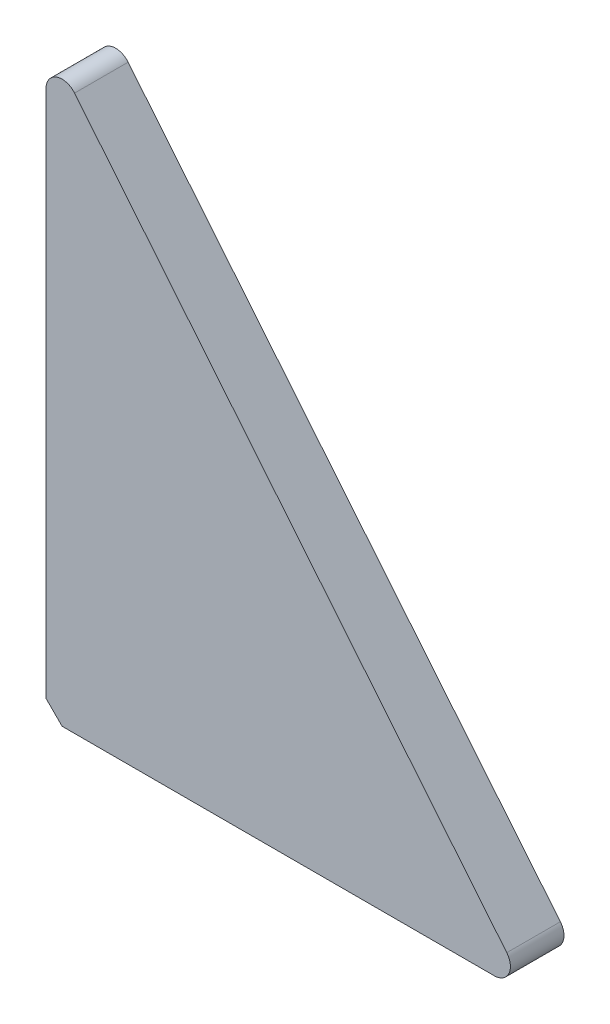
ISO-10303-21;
HEADER;
FILE_DESCRIPTION(('STEP AP214'),'2;1');
FILE_NAME('part.step','',(''),(''),'','','');
FILE_SCHEMA(('AUTOMOTIVE_DESIGN { 1 0 10303 214 1 1 1 1 }'));
ENDSEC;
DATA;
#1=APPLICATION_CONTEXT('core data for automotive mechanical design processes');
#2=APPLICATION_PROTOCOL_DEFINITION('international standard','automotive_design',2000,#1);
#3=PRODUCT_CONTEXT('',#1,'mechanical');
#4=PRODUCT('Part','Part','',(#3));
#5=PRODUCT_RELATED_PRODUCT_CATEGORY('part','',(#4));
#6=PRODUCT_DEFINITION_FORMATION('','',#4);
#7=PRODUCT_DEFINITION_CONTEXT('part definition',#1,'design');
#8=PRODUCT_DEFINITION('design','',#6,#7);
#9=PRODUCT_DEFINITION_SHAPE('','',#8);
#10=(LENGTH_UNIT() NAMED_UNIT(*) SI_UNIT(.MILLI.,.METRE.));
#11=(NAMED_UNIT(*) PLANE_ANGLE_UNIT() SI_UNIT($,.RADIAN.));
#12=(NAMED_UNIT(*) SI_UNIT($,.STERADIAN.) SOLID_ANGLE_UNIT());
#13=UNCERTAINTY_MEASURE_WITH_UNIT(LENGTH_MEASURE(1.E-05),#10,'distance_accuracy_value','');
#14=(GEOMETRIC_REPRESENTATION_CONTEXT(3) GLOBAL_UNCERTAINTY_ASSIGNED_CONTEXT((#13)) GLOBAL_UNIT_ASSIGNED_CONTEXT((#10,
#11,#12)) REPRESENTATION_CONTEXT('',''));
#15=CARTESIAN_POINT('',(0.,0.,0.));
#16=DIRECTION('',(0.,0.,1.));
#17=DIRECTION('',(1.,0.,0.));
#18=AXIS2_PLACEMENT_3D('',#15,#16,#17);
#19=CARTESIAN_POINT('',(90.,0.,10.));
#20=DIRECTION('',(0.,1.,0.));
#21=DIRECTION('',(-1.,0.,0.));
#22=AXIS2_PLACEMENT_3D('',#19,#20,#21);
#23=PLANE('',#22);
#24=DIRECTION('',(1.,0.,0.));
#25=VECTOR('',#24,1.);
#26=CARTESIAN_POINT('',(90.,0.,0.));
#27=LINE('',#26,#25);
#28=CARTESIAN_POINT('',(3.00000000000006,0.,0.));
#29=VERTEX_POINT('',#28);
#30=CARTESIAN_POINT('',(83.6692717081222,0.,0.));
#31=VERTEX_POINT('',#30);
#32=EDGE_CURVE('E105',#29,#31,#27,.T.);
#33=ORIENTED_EDGE('',*,*,#32,.T.);
#34=DIRECTION('',(0.,0.,-1.));
#35=VECTOR('',#34,1.);
#36=CARTESIAN_POINT('',(83.6692717081222,0.,10.));
#37=LINE('',#36,#35);
#38=CARTESIAN_POINT('',(83.6692717081222,0.,10.));
#39=VERTEX_POINT('',#38);
#40=EDGE_CURVE('E60',#31,#39,#37,.F.);
#41=ORIENTED_EDGE('',*,*,#40,.T.);
#42=DIRECTION('',(1.,0.,0.));
#43=VECTOR('',#42,1.);
#44=CARTESIAN_POINT('',(90.,0.,10.));
#45=LINE('',#44,#43);
#46=CARTESIAN_POINT('',(3.00000000000006,0.,10.));
#47=VERTEX_POINT('',#46);
#48=EDGE_CURVE('E106',#47,#39,#45,.T.);
#49=ORIENTED_EDGE('',*,*,#48,.F.);
#50=DIRECTION('',(0.,0.,-1.));
#51=VECTOR('',#50,1.);
#52=CARTESIAN_POINT('',(3.00000000000003,0.,10.));
#53=LINE('',#52,#51);
#54=EDGE_CURVE('E98',#47,#29,#53,.T.);
#55=ORIENTED_EDGE('',*,*,#54,.T.);
#56=EDGE_LOOP('',(#33,#41,#49,#55));
#57=FACE_BOUND('',#56,.T.);
#58=ADVANCED_FACE('F37',(#57),#23,.F.);
#59=CARTESIAN_POINT('',(0.,110.,10.));
#60=DIRECTION('',(-0.773957299203321,-0.633237790257263,0.));
#61=DIRECTION('',(0.633237790257263,-0.773957299203321,0.));
#62=AXIS2_PLACEMENT_3D('',#59,#60,#61);
#63=PLANE('',#62);
#64=DIRECTION('',(-0.633237790257263,0.773957299203321,0.));
#65=VECTOR('',#64,1.);
#66=CARTESIAN_POINT('',(0.,110.,10.));
#67=LINE('',#66,#65);
#68=CARTESIAN_POINT('',(85.9911436057322,4.89971337077176,10.));
#69=VERTEX_POINT('',#68);
#70=CARTESIAN_POINT('',(5.32187189760997,103.495489902921,10.));
#71=VERTEX_POINT('',#70);
#72=EDGE_CURVE('E136',#69,#71,#67,.T.);
#73=ORIENTED_EDGE('',*,*,#72,.F.);
#74=DIRECTION('',(0.,0.,-1.));
#75=VECTOR('',#74,1.);
#76=CARTESIAN_POINT('',(85.9911436057322,4.89971337077176,10.));
#77=LINE('',#76,#75);
#78=CARTESIAN_POINT('',(85.9911436057322,4.89971337077176,0.));
#79=VERTEX_POINT('',#78);
#80=EDGE_CURVE('E126',#69,#79,#77,.T.);
#81=ORIENTED_EDGE('',*,*,#80,.T.);
#82=DIRECTION('',(-0.633237790257263,0.773957299203321,0.));
#83=VECTOR('',#82,1.);
#84=CARTESIAN_POINT('',(0.,110.,0.));
#85=LINE('',#84,#83);
#86=CARTESIAN_POINT('',(5.32187189760997,103.495489902921,0.));
#87=VERTEX_POINT('',#86);
#88=EDGE_CURVE('E112',#79,#87,#85,.T.);
#89=ORIENTED_EDGE('',*,*,#88,.T.);
#90=DIRECTION('',(0.,0.,-1.));
#91=VECTOR('',#90,1.);
#92=CARTESIAN_POINT('',(5.32187189760997,103.495489902921,10.));
#93=LINE('',#92,#91);
#94=EDGE_CURVE('E124',#87,#71,#93,.F.);
#95=ORIENTED_EDGE('',*,*,#94,.T.);
#96=EDGE_LOOP('',(#73,#81,#89,#95));
#97=FACE_BOUND('',#96,.T.);
#98=ADVANCED_FACE('F140',(#97),#63,.F.);
#99=CARTESIAN_POINT('',(0.,0.,10.));
#100=DIRECTION('',(1.,0.,0.));
#101=DIRECTION('',(0.,0.,-1.));
#102=AXIS2_PLACEMENT_3D('',#99,#100,#101);
#103=PLANE('',#102);
#104=DIRECTION('',(0.,-1.,0.));
#105=VECTOR('',#104,1.);
#106=CARTESIAN_POINT('',(0.,0.,10.));
#107=LINE('',#106,#105);
#108=CARTESIAN_POINT('',(0.,101.595776532149,10.));
#109=VERTEX_POINT('',#108);
#110=CARTESIAN_POINT('',(0.,3.00000000000003,10.));
#111=VERTEX_POINT('',#110);
#112=EDGE_CURVE('E107',#109,#111,#107,.T.);
#113=ORIENTED_EDGE('',*,*,#112,.F.);
#114=DIRECTION('',(0.,0.,-1.));
#115=VECTOR('',#114,1.);
#116=CARTESIAN_POINT('',(0.,101.595776532149,10.));
#117=LINE('',#116,#115);
#118=CARTESIAN_POINT('',(0.,101.595776532149,0.));
#119=VERTEX_POINT('',#118);
#120=EDGE_CURVE('E11',#109,#119,#117,.T.);
#121=ORIENTED_EDGE('',*,*,#120,.T.);
#122=DIRECTION('',(0.,-1.,0.));
#123=VECTOR('',#122,1.);
#124=CARTESIAN_POINT('',(0.,0.,0.));
#125=LINE('',#124,#123);
#126=CARTESIAN_POINT('',(0.,3.00000000000003,0.));
#127=VERTEX_POINT('',#126);
#128=EDGE_CURVE('E115',#119,#127,#125,.T.);
#129=ORIENTED_EDGE('',*,*,#128,.T.);
#130=DIRECTION('',(0.,0.,1.));
#131=VECTOR('',#130,1.);
#132=CARTESIAN_POINT('',(0.,3.00000000000003,10.));
#133=LINE('',#132,#131);
#134=EDGE_CURVE('E100',#127,#111,#133,.T.);
#135=ORIENTED_EDGE('',*,*,#134,.T.);
#136=EDGE_LOOP('',(#113,#121,#129,#135));
#137=FACE_BOUND('',#136,.T.);
#138=ADVANCED_FACE('F155',(#137),#103,.F.);
#139=CARTESIAN_POINT('',(0.,0.,10.));
#140=DIRECTION('',(0.,0.,-1.));
#141=DIRECTION('',(-1.,0.,0.));
#142=AXIS2_PLACEMENT_3D('',#139,#140,#141);
#143=PLANE('',#142);
#144=ORIENTED_EDGE('',*,*,#48,.T.);
#145=CARTESIAN_POINT('',(83.6692717081222,2.99999999999999,10.));
#146=DIRECTION('',(0.,0.,-1.));
#147=DIRECTION('',(-1.,0.,0.));
#148=AXIS2_PLACEMENT_3D('',#145,#146,#147);
#149=CIRCLE('',#148,3.);
#150=EDGE_CURVE('E45',#39,#69,#149,.F.);
#151=ORIENTED_EDGE('',*,*,#150,.T.);
#152=ORIENTED_EDGE('',*,*,#72,.T.);
#153=CARTESIAN_POINT('',(3.,101.595776532149,10.));
#154=DIRECTION('',(0.,0.,-1.));
#155=DIRECTION('',(-1.,0.,0.));
#156=AXIS2_PLACEMENT_3D('',#153,#154,#155);
#157=CIRCLE('',#156,3.);
#158=EDGE_CURVE('E52',#71,#109,#157,.F.);
#159=ORIENTED_EDGE('',*,*,#158,.T.);
#160=ORIENTED_EDGE('',*,*,#112,.T.);
#161=DIRECTION('',(-0.707106781186548,0.707106781186548,0.));
#162=VECTOR('',#161,1.);
#163=CARTESIAN_POINT('',(3.00000000000003,0.,10.));
#164=LINE('',#163,#162);
#165=EDGE_CURVE('E122',#111,#47,#164,.F.);
#166=ORIENTED_EDGE('',*,*,#165,.T.);
#167=EDGE_LOOP('',(#144,#151,#152,#159,#160,#166));
#168=FACE_BOUND('',#167,.T.);
#169=ADVANCED_FACE('F135',(#168),#143,.F.);
#170=CARTESIAN_POINT('',(0.,0.,0.));
#171=DIRECTION('',(0.,0.,-1.));
#172=DIRECTION('',(-1.,0.,0.));
#173=AXIS2_PLACEMENT_3D('',#170,#171,#172);
#174=PLANE('',#173);
#175=ORIENTED_EDGE('',*,*,#88,.F.);
#176=CARTESIAN_POINT('',(83.6692717081222,2.99999999999999,0.));
#177=DIRECTION('',(0.,0.,-1.));
#178=DIRECTION('',(-1.,0.,0.));
#179=AXIS2_PLACEMENT_3D('',#176,#177,#178);
#180=CIRCLE('',#179,3.);
#181=EDGE_CURVE('E111',#79,#31,#180,.T.);
#182=ORIENTED_EDGE('',*,*,#181,.T.);
#183=ORIENTED_EDGE('',*,*,#32,.F.);
#184=DIRECTION('',(0.707106781186548,-0.707106781186548,0.));
#185=VECTOR('',#184,1.);
#186=CARTESIAN_POINT('',(1.50000000000002,1.50000000000002,0.));
#187=LINE('',#186,#185);
#188=EDGE_CURVE('E94',#29,#127,#187,.F.);
#189=ORIENTED_EDGE('',*,*,#188,.T.);
#190=ORIENTED_EDGE('',*,*,#128,.F.);
#191=CARTESIAN_POINT('',(3.,101.595776532149,0.));
#192=DIRECTION('',(0.,0.,-1.));
#193=DIRECTION('',(-1.,0.,0.));
#194=AXIS2_PLACEMENT_3D('',#191,#192,#193);
#195=CIRCLE('',#194,3.);
#196=EDGE_CURVE('E129',#119,#87,#195,.T.);
#197=ORIENTED_EDGE('',*,*,#196,.T.);
#198=EDGE_LOOP('',(#175,#182,#183,#189,#190,#197));
#199=FACE_BOUND('',#198,.T.);
#200=ADVANCED_FACE('F110',(#199),#174,.T.);
#201=CARTESIAN_POINT('',(3.00000000000003,0.,10.));
#202=DIRECTION('',(0.707106781186547,0.707106781186547,0.));
#203=DIRECTION('',(0.,0.,-1.));
#204=AXIS2_PLACEMENT_3D('',#201,#202,#203);
#205=PLANE('',#204);
#206=ORIENTED_EDGE('',*,*,#165,.F.);
#207=ORIENTED_EDGE('',*,*,#134,.F.);
#208=ORIENTED_EDGE('',*,*,#188,.F.);
#209=ORIENTED_EDGE('',*,*,#54,.F.);
#210=EDGE_LOOP('',(#206,#207,#208,#209));
#211=FACE_BOUND('',#210,.T.);
#212=ADVANCED_FACE('F97',(#211),#205,.F.);
#213=CARTESIAN_POINT('',(83.6692717081222,2.99999999999999,10.));
#214=DIRECTION('',(0.,0.,-1.));
#215=DIRECTION('',(-1.,0.,0.));
#216=AXIS2_PLACEMENT_3D('',#213,#214,#215);
#217=CYLINDRICAL_SURFACE('',#216,3.);
#218=ORIENTED_EDGE('',*,*,#150,.F.);
#219=ORIENTED_EDGE('',*,*,#40,.F.);
#220=ORIENTED_EDGE('',*,*,#181,.F.);
#221=ORIENTED_EDGE('',*,*,#80,.F.);
#222=EDGE_LOOP('',(#218,#219,#220,#221));
#223=FACE_BOUND('',#222,.T.);
#224=ADVANCED_FACE('F142',(#223),#217,.T.);
#225=CARTESIAN_POINT('',(3.,101.595776532149,10.));
#226=DIRECTION('',(0.,0.,-1.));
#227=DIRECTION('',(-1.,0.,0.));
#228=AXIS2_PLACEMENT_3D('',#225,#226,#227);
#229=CYLINDRICAL_SURFACE('',#228,3.);
#230=ORIENTED_EDGE('',*,*,#158,.F.);
#231=ORIENTED_EDGE('',*,*,#94,.F.);
#232=ORIENTED_EDGE('',*,*,#196,.F.);
#233=ORIENTED_EDGE('',*,*,#120,.F.);
#234=EDGE_LOOP('',(#230,#231,#232,#233));
#235=FACE_BOUND('',#234,.T.);
#236=ADVANCED_FACE('F39',(#235),#229,.T.);
#237=CLOSED_SHELL('',(#58,#98,#138,#169,#200,#212,#224,#236));
#238=MANIFOLD_SOLID_BREP('B2',#237);
#239=ADVANCED_BREP_SHAPE_REPRESENTATION('',(#18,#238),#14);
#240=SHAPE_DEFINITION_REPRESENTATION(#9,#239);
ENDSEC;
END-ISO-10303-21;
